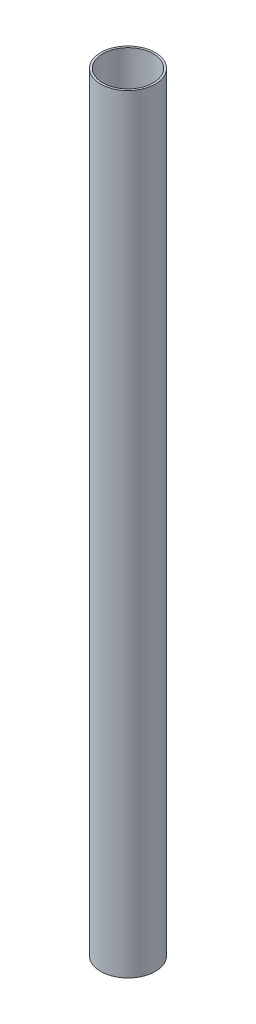
ISO-10303-21;
HEADER;
FILE_DESCRIPTION(('STEP AP214'),'2;1');
FILE_NAME('part.step','',(''),(''),'','','');
FILE_SCHEMA(('AUTOMOTIVE_DESIGN { 1 0 10303 214 1 1 1 1 }'));
ENDSEC;
DATA;
#1=APPLICATION_CONTEXT('core data for automotive mechanical design processes');
#2=APPLICATION_PROTOCOL_DEFINITION('international standard','automotive_design',2000,#1);
#3=PRODUCT_CONTEXT('',#1,'mechanical');
#4=PRODUCT('Part','Part','',(#3));
#5=PRODUCT_RELATED_PRODUCT_CATEGORY('part','',(#4));
#6=PRODUCT_DEFINITION_FORMATION('','',#4);
#7=PRODUCT_DEFINITION_CONTEXT('part definition',#1,'design');
#8=PRODUCT_DEFINITION('design','',#6,#7);
#9=PRODUCT_DEFINITION_SHAPE('','',#8);
#10=(LENGTH_UNIT() NAMED_UNIT(*) SI_UNIT(.MILLI.,.METRE.));
#11=(NAMED_UNIT(*) PLANE_ANGLE_UNIT() SI_UNIT($,.RADIAN.));
#12=(NAMED_UNIT(*) SI_UNIT($,.STERADIAN.) SOLID_ANGLE_UNIT());
#13=UNCERTAINTY_MEASURE_WITH_UNIT(LENGTH_MEASURE(1.E-05),#10,'distance_accuracy_value','');
#14=(GEOMETRIC_REPRESENTATION_CONTEXT(3) GLOBAL_UNCERTAINTY_ASSIGNED_CONTEXT((#13)) GLOBAL_UNIT_ASSIGNED_CONTEXT((#10,
#11,#12)) REPRESENTATION_CONTEXT('',''));
#15=CARTESIAN_POINT('',(0.,0.,0.));
#16=DIRECTION('',(0.,0.,1.));
#17=DIRECTION('',(1.,0.,0.));
#18=AXIS2_PLACEMENT_3D('',#15,#16,#17);
#19=CARTESIAN_POINT('',(0.,760.,0.));
#20=DIRECTION('',(0.,1.,0.));
#21=DIRECTION('',(0.,0.,1.));
#22=AXIS2_PLACEMENT_3D('',#19,#20,#21);
#23=PLANE('',#22);
#24=CARTESIAN_POINT('',(0.,760.,0.));
#25=DIRECTION('',(0.,1.,0.));
#26=DIRECTION('',(0.,0.,1.));
#27=AXIS2_PLACEMENT_3D('',#24,#25,#26);
#28=CIRCLE('',#27,27.);
#29=CARTESIAN_POINT('',(0.,760.,27.));
#30=VERTEX_POINT('',#29);
#31=EDGE_CURVE('E11',#30,#30,#28,.T.);
#32=ORIENTED_EDGE('',*,*,#31,.T.);
#33=EDGE_LOOP('',(#32));
#34=FACE_BOUND('',#33,.T.);
#35=CARTESIAN_POINT('',(0.,760.,0.));
#36=DIRECTION('',(0.,1.,0.));
#37=DIRECTION('',(0.,0.,1.));
#38=AXIS2_PLACEMENT_3D('',#35,#36,#37);
#39=CIRCLE('',#38,25.);
#40=CARTESIAN_POINT('',(0.,760.,25.));
#41=VERTEX_POINT('',#40);
#42=EDGE_CURVE('E56',#41,#41,#39,.T.);
#43=ORIENTED_EDGE('',*,*,#42,.F.);
#44=EDGE_LOOP('',(#43));
#45=FACE_BOUND('',#44,.T.);
#46=ADVANCED_FACE('F43',(#34,#45),#23,.T.);
#47=CARTESIAN_POINT('',(0.,0.,0.));
#48=DIRECTION('',(0.,1.,0.));
#49=DIRECTION('',(0.,0.,1.));
#50=AXIS2_PLACEMENT_3D('',#47,#48,#49);
#51=PLANE('',#50);
#52=CARTESIAN_POINT('',(0.,0.,0.));
#53=DIRECTION('',(0.,1.,0.));
#54=DIRECTION('',(0.,0.,1.));
#55=AXIS2_PLACEMENT_3D('',#52,#53,#54);
#56=CIRCLE('',#55,27.);
#57=CARTESIAN_POINT('',(0.,0.,27.));
#58=VERTEX_POINT('',#57);
#59=EDGE_CURVE('E47',#58,#58,#56,.T.);
#60=ORIENTED_EDGE('',*,*,#59,.F.);
#61=EDGE_LOOP('',(#60));
#62=FACE_BOUND('',#61,.T.);
#63=CARTESIAN_POINT('',(0.,0.,0.));
#64=DIRECTION('',(0.,1.,0.));
#65=DIRECTION('',(0.,0.,1.));
#66=AXIS2_PLACEMENT_3D('',#63,#64,#65);
#67=CIRCLE('',#66,25.);
#68=CARTESIAN_POINT('',(0.,0.,25.));
#69=VERTEX_POINT('',#68);
#70=EDGE_CURVE('E58',#69,#69,#67,.T.);
#71=ORIENTED_EDGE('',*,*,#70,.T.);
#72=EDGE_LOOP('',(#71));
#73=FACE_BOUND('',#72,.T.);
#74=ADVANCED_FACE('F70',(#62,#73),#51,.F.);
#75=CARTESIAN_POINT('',(0.,760.,0.));
#76=DIRECTION('',(0.,-1.,0.));
#77=DIRECTION('',(0.,0.,-1.));
#78=AXIS2_PLACEMENT_3D('',#75,#76,#77);
#79=CYLINDRICAL_SURFACE('',#78,27.);
#80=ORIENTED_EDGE('',*,*,#31,.F.);
#81=EDGE_LOOP('',(#80));
#82=FACE_BOUND('',#81,.T.);
#83=ORIENTED_EDGE('',*,*,#59,.T.);
#84=EDGE_LOOP('',(#83));
#85=FACE_BOUND('',#84,.T.);
#86=ADVANCED_FACE('F45',(#82,#85),#79,.T.);
#87=CARTESIAN_POINT('',(0.,760.,0.));
#88=DIRECTION('',(0.,-1.,0.));
#89=DIRECTION('',(0.,0.,-1.));
#90=AXIS2_PLACEMENT_3D('',#87,#88,#89);
#91=CYLINDRICAL_SURFACE('',#90,25.);
#92=ORIENTED_EDGE('',*,*,#42,.T.);
#93=EDGE_LOOP('',(#92));
#94=FACE_BOUND('',#93,.T.);
#95=ORIENTED_EDGE('',*,*,#70,.F.);
#96=EDGE_LOOP('',(#95));
#97=FACE_BOUND('',#96,.T.);
#98=ADVANCED_FACE('F66',(#94,#97),#91,.F.);
#99=CLOSED_SHELL('',(#46,#74,#86,#98));
#100=MANIFOLD_SOLID_BREP('B2',#99);
#101=ADVANCED_BREP_SHAPE_REPRESENTATION('',(#18,#100),#14);
#102=SHAPE_DEFINITION_REPRESENTATION(#9,#101);
ENDSEC;
END-ISO-10303-21;
